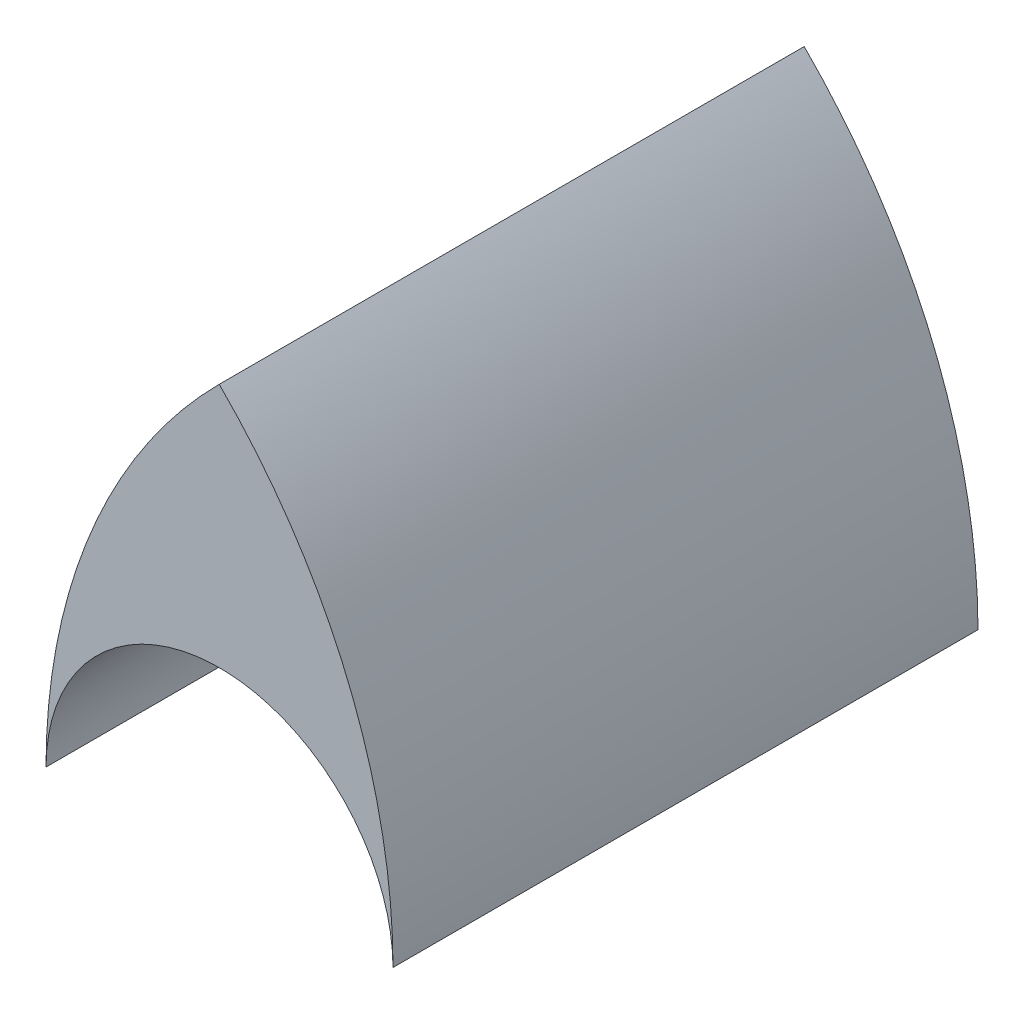
ISO-10303-21;
HEADER;
FILE_DESCRIPTION(('STEP AP214'),'2;1');
FILE_NAME('part.step','',(''),(''),'','','');
FILE_SCHEMA(('AUTOMOTIVE_DESIGN { 1 0 10303 214 1 1 1 1 }'));
ENDSEC;
DATA;
#1=APPLICATION_CONTEXT('core data for automotive mechanical design processes');
#2=APPLICATION_PROTOCOL_DEFINITION('international standard','automotive_design',2000,#1);
#3=PRODUCT_CONTEXT('',#1,'mechanical');
#4=PRODUCT('Part','Part','',(#3));
#5=PRODUCT_RELATED_PRODUCT_CATEGORY('part','',(#4));
#6=PRODUCT_DEFINITION_FORMATION('','',#4);
#7=PRODUCT_DEFINITION_CONTEXT('part definition',#1,'design');
#8=PRODUCT_DEFINITION('design','',#6,#7);
#9=PRODUCT_DEFINITION_SHAPE('','',#8);
#10=(LENGTH_UNIT() NAMED_UNIT(*) SI_UNIT(.MILLI.,.METRE.));
#11=(NAMED_UNIT(*) PLANE_ANGLE_UNIT() SI_UNIT($,.RADIAN.));
#12=(NAMED_UNIT(*) SI_UNIT($,.STERADIAN.) SOLID_ANGLE_UNIT());
#13=UNCERTAINTY_MEASURE_WITH_UNIT(LENGTH_MEASURE(1.E-05),#10,'distance_accuracy_value','');
#14=(GEOMETRIC_REPRESENTATION_CONTEXT(3) GLOBAL_UNCERTAINTY_ASSIGNED_CONTEXT((#13)) GLOBAL_UNIT_ASSIGNED_CONTEXT((#10,
#11,#12)) REPRESENTATION_CONTEXT('',''));
#15=CARTESIAN_POINT('',(0.,0.,0.));
#16=DIRECTION('',(0.,0.,1.));
#17=DIRECTION('',(1.,0.,0.));
#18=AXIS2_PLACEMENT_3D('',#15,#16,#17);
#19=CARTESIAN_POINT('',(-62.1568004285692,-0.0397489208692342,-8.));
#20=DIRECTION('',(0.,0.,1.));
#21=DIRECTION('',(1.,0.,0.));
#22=AXIS2_PLACEMENT_3D('',#19,#20,#21);
#23=CYLINDRICAL_SURFACE('',#22,22.279896339874);
#24=CARTESIAN_POINT('',(-62.1568004285692,-0.0397489208692342,14.));
#25=DIRECTION('',(0.,0.,1.));
#26=DIRECTION('',(1.,0.,0.));
#27=AXIS2_PLACEMENT_3D('',#24,#25,#26);
#28=CIRCLE('',#27,22.279896339874);
#29=CARTESIAN_POINT('',(-39.8769362093889,-0.00191652183768425,14.));
#30=VERTEX_POINT('',#29);
#31=CARTESIAN_POINT('',(-46.4130430201876,15.7250182382599,14.));
#32=VERTEX_POINT('',#31);
#33=EDGE_CURVE('E81',#30,#32,#28,.T.);
#34=ORIENTED_EDGE('',*,*,#33,.F.);
#35=DIRECTION('',(0.,0.,1.));
#36=VECTOR('',#35,1.);
#37=CARTESIAN_POINT('',(-39.8769362093889,-0.00191652183768425,-8.));
#38=LINE('',#37,#36);
#39=CARTESIAN_POINT('',(-39.8769362093889,-0.00191652183768425,-8.));
#40=VERTEX_POINT('',#39);
#41=EDGE_CURVE('E36',#40,#30,#38,.T.);
#42=ORIENTED_EDGE('',*,*,#41,.F.);
#43=CARTESIAN_POINT('',(-62.1568004285692,-0.0397489208692342,-8.));
#44=DIRECTION('',(0.,0.,1.));
#45=DIRECTION('',(1.,0.,0.));
#46=AXIS2_PLACEMENT_3D('',#43,#44,#45);
#47=CIRCLE('',#46,22.279896339874);
#48=CARTESIAN_POINT('',(-46.4130430201876,15.7250182382599,-8.));
#49=VERTEX_POINT('',#48);
#50=EDGE_CURVE('E63',#40,#49,#47,.T.);
#51=ORIENTED_EDGE('',*,*,#50,.T.);
#52=DIRECTION('',(0.,0.,1.));
#53=VECTOR('',#52,1.);
#54=CARTESIAN_POINT('',(-46.4130430201876,15.7250182382599,-8.));
#55=LINE('',#54,#53);
#56=EDGE_CURVE('E11',#49,#32,#55,.T.);
#57=ORIENTED_EDGE('',*,*,#56,.T.);
#58=EDGE_LOOP('',(#34,#42,#51,#57));
#59=FACE_BOUND('',#58,.T.);
#60=ADVANCED_FACE('F17',(#59),#23,.T.);
#61=CARTESIAN_POINT('',(-30.6482758610584,-0.018739170121674,-8.));
#62=DIRECTION('',(0.,0.,1.));
#63=DIRECTION('',(1.,0.,0.));
#64=AXIS2_PLACEMENT_3D('',#61,#62,#63);
#65=CYLINDRICAL_SURFACE('',#64,22.279896339874);
#66=CARTESIAN_POINT('',(-30.6482758610584,-0.018739170121674,14.));
#67=DIRECTION('',(0.,0.,1.));
#68=DIRECTION('',(1.,0.,0.));
#69=AXIS2_PLACEMENT_3D('',#66,#67,#68);
#70=CIRCLE('',#69,22.279896339874);
#71=CARTESIAN_POINT('',(-52.9281505532747,-0.00095901786728855,14.));
#72=VERTEX_POINT('',#71);
#73=EDGE_CURVE('E58',#32,#72,#70,.T.);
#74=ORIENTED_EDGE('',*,*,#73,.F.);
#75=ORIENTED_EDGE('',*,*,#56,.F.);
#76=CARTESIAN_POINT('',(-30.6482758610584,-0.018739170121674,-8.));
#77=DIRECTION('',(0.,0.,1.));
#78=DIRECTION('',(1.,0.,0.));
#79=AXIS2_PLACEMENT_3D('',#76,#77,#78);
#80=CIRCLE('',#79,22.279896339874);
#81=CARTESIAN_POINT('',(-52.9281505532747,-0.00095901786728855,-8.));
#82=VERTEX_POINT('',#81);
#83=EDGE_CURVE('E55',#49,#82,#80,.T.);
#84=ORIENTED_EDGE('',*,*,#83,.T.);
#85=CARTESIAN_POINT('',(-52.928165106324,-0.000959006253461977,-8.));
#86=DIRECTION('',(0.,0.,1.));
#87=VECTOR('',#86,1.);
#88=LINE('',#85,#87);
#89=EDGE_CURVE('E27',#82,#72,#88,.T.);
#90=ORIENTED_EDGE('',*,*,#89,.T.);
#91=EDGE_LOOP('',(#74,#75,#84,#90));
#92=FACE_BOUND('',#91,.T.);
#93=ADVANCED_FACE('F54',(#92),#65,.T.);
#94=CARTESIAN_POINT('',(-46.4025381448138,-0.0292440454954593,-8.));
#95=DIRECTION('',(0.,0.,1.));
#96=DIRECTION('',(1.,0.,0.));
#97=AXIS2_PLACEMENT_3D('',#94,#95,#96);
#98=CYLINDRICAL_SURFACE('',#97,6.52565915545479);
#99=CARTESIAN_POINT('',(-46.4025381448138,-0.0292440454954593,14.));
#100=DIRECTION('',(0.,0.,1.));
#101=DIRECTION('',(1.,0.,0.));
#102=AXIS2_PLACEMENT_3D('',#99,#100,#101);
#103=CIRCLE('',#102,6.52565915545479);
#104=EDGE_CURVE('E68',#30,#72,#103,.T.);
#105=ORIENTED_EDGE('',*,*,#104,.T.);
#106=ORIENTED_EDGE('',*,*,#89,.F.);
#107=CARTESIAN_POINT('',(-46.4025381448138,-0.0292440454954593,-8.));
#108=DIRECTION('',(0.,0.,1.));
#109=DIRECTION('',(1.,0.,0.));
#110=AXIS2_PLACEMENT_3D('',#107,#108,#109);
#111=CIRCLE('',#110,6.52565915545479);
#112=EDGE_CURVE('E64',#40,#82,#111,.T.);
#113=ORIENTED_EDGE('',*,*,#112,.F.);
#114=ORIENTED_EDGE('',*,*,#41,.T.);
#115=EDGE_LOOP('',(#105,#106,#113,#114));
#116=FACE_BOUND('',#115,.T.);
#117=ADVANCED_FACE('F95',(#116),#98,.F.);
#118=CARTESIAN_POINT('',(0.,0.,-8.));
#119=DIRECTION('',(0.,0.,1.));
#120=DIRECTION('',(0.,-1.,0.));
#121=AXIS2_PLACEMENT_3D('',#118,#119,#120);
#122=PLANE('',#121);
#123=ORIENTED_EDGE('',*,*,#50,.F.);
#124=ORIENTED_EDGE('',*,*,#112,.T.);
#125=ORIENTED_EDGE('',*,*,#83,.F.);
#126=EDGE_LOOP('',(#123,#124,#125));
#127=FACE_BOUND('',#126,.T.);
#128=ADVANCED_FACE('F62',(#127),#122,.F.);
#129=CARTESIAN_POINT('',(0.,0.,14.));
#130=DIRECTION('',(0.,0.,1.));
#131=DIRECTION('',(0.,-1.,0.));
#132=AXIS2_PLACEMENT_3D('',#129,#130,#131);
#133=PLANE('',#132);
#134=ORIENTED_EDGE('',*,*,#33,.T.);
#135=ORIENTED_EDGE('',*,*,#73,.T.);
#136=ORIENTED_EDGE('',*,*,#104,.F.);
#137=EDGE_LOOP('',(#134,#135,#136));
#138=FACE_BOUND('',#137,.T.);
#139=ADVANCED_FACE('F104',(#138),#133,.T.);
#140=CLOSED_SHELL('',(#60,#93,#117,#128,#139));
#141=MANIFOLD_SOLID_BREP('B1',#140);
#142=ADVANCED_BREP_SHAPE_REPRESENTATION('',(#18,#141),#14);
#143=SHAPE_DEFINITION_REPRESENTATION(#9,#142);
ENDSEC;
END-ISO-10303-21;
